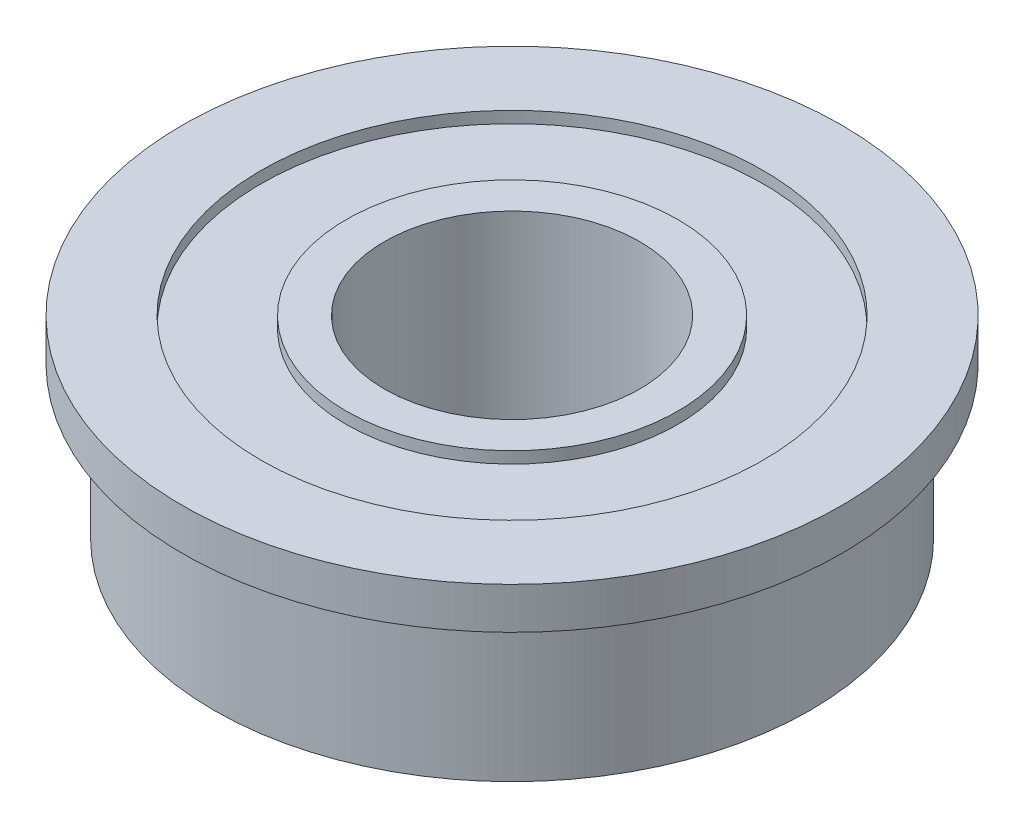
ISO-10303-21;
HEADER;
FILE_DESCRIPTION(('STEP AP214'),'2;1');
FILE_NAME('part.step','',(''),(''),'','','');
FILE_SCHEMA(('AUTOMOTIVE_DESIGN { 1 0 10303 214 1 1 1 1 }'));
ENDSEC;
DATA;
#1=APPLICATION_CONTEXT('core data for automotive mechanical design processes');
#2=APPLICATION_PROTOCOL_DEFINITION('international standard','automotive_design',2000,#1);
#3=PRODUCT_CONTEXT('',#1,'mechanical');
#4=PRODUCT('Part','Part','',(#3));
#5=PRODUCT_RELATED_PRODUCT_CATEGORY('part','',(#4));
#6=PRODUCT_DEFINITION_FORMATION('','',#4);
#7=PRODUCT_DEFINITION_CONTEXT('part definition',#1,'design');
#8=PRODUCT_DEFINITION('design','',#6,#7);
#9=PRODUCT_DEFINITION_SHAPE('','',#8);
#10=(LENGTH_UNIT() NAMED_UNIT(*) SI_UNIT(.MILLI.,.METRE.));
#11=(NAMED_UNIT(*) PLANE_ANGLE_UNIT() SI_UNIT($,.RADIAN.));
#12=(NAMED_UNIT(*) SI_UNIT($,.STERADIAN.) SOLID_ANGLE_UNIT());
#13=UNCERTAINTY_MEASURE_WITH_UNIT(LENGTH_MEASURE(1.E-05),#10,'distance_accuracy_value','');
#14=(GEOMETRIC_REPRESENTATION_CONTEXT(3) GLOBAL_UNCERTAINTY_ASSIGNED_CONTEXT((#13)) GLOBAL_UNIT_ASSIGNED_CONTEXT((#10,
#11,#12)) REPRESENTATION_CONTEXT('',''));
#15=CARTESIAN_POINT('',(0.,0.,0.));
#16=DIRECTION('',(0.,0.,1.));
#17=DIRECTION('',(1.,0.,0.));
#18=AXIS2_PLACEMENT_3D('',#15,#16,#17);
#19=CARTESIAN_POINT('',(0.,6.7691,0.));
#20=DIRECTION('',(0.,1.,0.));
#21=DIRECTION('',(0.,0.,1.));
#22=AXIS2_PLACEMENT_3D('',#19,#20,#21);
#23=CYLINDRICAL_SURFACE('',#22,9.3599);
#24=CARTESIAN_POINT('',(0.,7.2009,0.));
#25=DIRECTION('',(0.,1.,0.));
#26=DIRECTION('',(0.,0.,1.));
#27=AXIS2_PLACEMENT_3D('',#24,#25,#26);
#28=CIRCLE('',#27,9.3599);
#29=CARTESIAN_POINT('',(0.,7.2009,9.3599));
#30=VERTEX_POINT('',#29);
#31=EDGE_CURVE('E18',#30,#30,#28,.F.);
#32=ORIENTED_EDGE('',*,*,#31,.F.);
#33=EDGE_LOOP('',(#32));
#34=FACE_BOUND('',#33,.T.);
#35=CARTESIAN_POINT('',(0.,6.7691,0.));
#36=DIRECTION('',(0.,1.,0.));
#37=DIRECTION('',(0.,0.,1.));
#38=AXIS2_PLACEMENT_3D('',#35,#36,#37);
#39=CIRCLE('',#38,9.3599);
#40=CARTESIAN_POINT('',(0.,6.7691,9.3599));
#41=VERTEX_POINT('',#40);
#42=EDGE_CURVE('E46',#41,#41,#39,.T.);
#43=ORIENTED_EDGE('',*,*,#42,.F.);
#44=EDGE_LOOP('',(#43));
#45=FACE_BOUND('',#44,.T.);
#46=ADVANCED_FACE('F15',(#34,#45),#23,.F.);
#47=CARTESIAN_POINT('',(0.,7.2009,0.));
#48=DIRECTION('',(0.,1.,0.));
#49=DIRECTION('',(0.,0.,1.));
#50=AXIS2_PLACEMENT_3D('',#47,#48,#49);
#51=PLANE('',#50);
#52=CARTESIAN_POINT('',(0.,7.2009,0.));
#53=DIRECTION('',(0.,-1.,0.));
#54=DIRECTION('',(0.,0.,-1.));
#55=AXIS2_PLACEMENT_3D('',#52,#53,#54);
#56=CIRCLE('',#55,12.28725);
#57=CARTESIAN_POINT('',(0.,7.2009,-12.28725));
#58=VERTEX_POINT('',#57);
#59=EDGE_CURVE('E44',#58,#58,#56,.T.);
#60=ORIENTED_EDGE('',*,*,#59,.F.);
#61=EDGE_LOOP('',(#60));
#62=FACE_BOUND('',#61,.T.);
#63=ORIENTED_EDGE('',*,*,#31,.T.);
#64=EDGE_LOOP('',(#63));
#65=FACE_BOUND('',#64,.T.);
#66=ADVANCED_FACE('F53',(#62,#65),#51,.T.);
#67=CARTESIAN_POINT('',(0.,6.7691,0.));
#68=DIRECTION('',(0.,1.,0.));
#69=DIRECTION('',(0.,0.,1.));
#70=AXIS2_PLACEMENT_3D('',#67,#68,#69);
#71=PLANE('',#70);
#72=ORIENTED_EDGE('',*,*,#42,.T.);
#73=EDGE_LOOP('',(#72));
#74=FACE_BOUND('',#73,.T.);
#75=CARTESIAN_POINT('',(0.,6.7691,0.));
#76=DIRECTION('',(0.,1.,0.));
#77=DIRECTION('',(0.,0.,1.));
#78=AXIS2_PLACEMENT_3D('',#75,#76,#77);
#79=CIRCLE('',#78,6.1849);
#80=CARTESIAN_POINT('',(0.,6.7691,6.1849));
#81=VERTEX_POINT('',#80);
#82=EDGE_CURVE('E41',#81,#81,#79,.T.);
#83=ORIENTED_EDGE('',*,*,#82,.F.);
#84=EDGE_LOOP('',(#83));
#85=FACE_BOUND('',#84,.T.);
#86=ADVANCED_FACE('F61',(#74,#85),#71,.T.);
#87=CARTESIAN_POINT('',(0.,7.2009,0.));
#88=DIRECTION('',(0.,-1.,0.));
#89=DIRECTION('',(0.,0.,-1.));
#90=AXIS2_PLACEMENT_3D('',#87,#88,#89);
#91=CYLINDRICAL_SURFACE('',#90,12.28725);
#92=ORIENTED_EDGE('',*,*,#59,.T.);
#93=EDGE_LOOP('',(#92));
#94=FACE_BOUND('',#93,.T.);
#95=CARTESIAN_POINT('',(0.,5.6515,0.));
#96=DIRECTION('',(0.,-1.,0.));
#97=DIRECTION('',(0.,0.,-1.));
#98=AXIS2_PLACEMENT_3D('',#95,#96,#97);
#99=CIRCLE('',#98,12.28725);
#100=CARTESIAN_POINT('',(0.,5.6515,-12.28725));
#101=VERTEX_POINT('',#100);
#102=EDGE_CURVE('E38',#101,#101,#99,.F.);
#103=ORIENTED_EDGE('',*,*,#102,.T.);
#104=EDGE_LOOP('',(#103));
#105=FACE_BOUND('',#104,.T.);
#106=ADVANCED_FACE('F89',(#94,#105),#91,.T.);
#107=CARTESIAN_POINT('',(0.,6.7691,0.));
#108=DIRECTION('',(0.,1.,0.));
#109=DIRECTION('',(0.,0.,1.));
#110=AXIS2_PLACEMENT_3D('',#107,#108,#109);
#111=CYLINDRICAL_SURFACE('',#110,6.1849);
#112=ORIENTED_EDGE('',*,*,#82,.T.);
#113=EDGE_LOOP('',(#112));
#114=FACE_BOUND('',#113,.T.);
#115=CARTESIAN_POINT('',(0.,7.2009,0.));
#116=DIRECTION('',(0.,1.,0.));
#117=DIRECTION('',(0.,0.,1.));
#118=AXIS2_PLACEMENT_3D('',#115,#116,#117);
#119=CIRCLE('',#118,6.1849);
#120=CARTESIAN_POINT('',(0.,7.2009,6.1849));
#121=VERTEX_POINT('',#120);
#122=EDGE_CURVE('E35',#121,#121,#119,.T.);
#123=ORIENTED_EDGE('',*,*,#122,.F.);
#124=EDGE_LOOP('',(#123));
#125=FACE_BOUND('',#124,.T.);
#126=ADVANCED_FACE('F85',(#114,#125),#111,.T.);
#127=CARTESIAN_POINT('',(0.,5.6515,0.));
#128=DIRECTION('',(0.,1.,0.));
#129=DIRECTION('',(0.,0.,1.));
#130=AXIS2_PLACEMENT_3D('',#127,#128,#129);
#131=PLANE('',#130);
#132=CARTESIAN_POINT('',(0.,5.6515,0.));
#133=DIRECTION('',(0.,-1.,0.));
#134=DIRECTION('',(0.,0.,-1.));
#135=AXIS2_PLACEMENT_3D('',#132,#133,#134);
#136=CIRCLE('',#135,11.1125);
#137=CARTESIAN_POINT('',(0.,5.6515,-11.1125));
#138=VERTEX_POINT('',#137);
#139=EDGE_CURVE('E32',#138,#138,#136,.T.);
#140=ORIENTED_EDGE('',*,*,#139,.F.);
#141=EDGE_LOOP('',(#140));
#142=FACE_BOUND('',#141,.T.);
#143=ORIENTED_EDGE('',*,*,#102,.F.);
#144=EDGE_LOOP('',(#143));
#145=FACE_BOUND('',#144,.T.);
#146=ADVANCED_FACE('F81',(#142,#145),#131,.F.);
#147=CARTESIAN_POINT('',(0.,7.2009,0.));
#148=DIRECTION('',(0.,1.,0.));
#149=DIRECTION('',(0.,0.,1.));
#150=AXIS2_PLACEMENT_3D('',#147,#148,#149);
#151=PLANE('',#150);
#152=ORIENTED_EDGE('',*,*,#122,.T.);
#153=EDGE_LOOP('',(#152));
#154=FACE_BOUND('',#153,.T.);
#155=CARTESIAN_POINT('',(0.,7.2009,0.));
#156=DIRECTION('',(0.,-1.,0.));
#157=DIRECTION('',(0.,0.,-1.));
#158=AXIS2_PLACEMENT_3D('',#155,#156,#157);
#159=CIRCLE('',#158,4.7625);
#160=CARTESIAN_POINT('',(0.,7.2009,-4.7625));
#161=VERTEX_POINT('',#160);
#162=EDGE_CURVE('E27',#161,#161,#159,.T.);
#163=ORIENTED_EDGE('',*,*,#162,.T.);
#164=EDGE_LOOP('',(#163));
#165=FACE_BOUND('',#164,.T.);
#166=ADVANCED_FACE('F77',(#154,#165),#151,.T.);
#167=CARTESIAN_POINT('',(0.,5.6515,0.));
#168=DIRECTION('',(0.,-1.,0.));
#169=DIRECTION('',(0.,0.,-1.));
#170=AXIS2_PLACEMENT_3D('',#167,#168,#169);
#171=CYLINDRICAL_SURFACE('',#170,11.1125);
#172=ORIENTED_EDGE('',*,*,#139,.T.);
#173=EDGE_LOOP('',(#172));
#174=FACE_BOUND('',#173,.T.);
#175=CARTESIAN_POINT('',(0.,0.,0.));
#176=DIRECTION('',(0.,-1.,0.));
#177=DIRECTION('',(0.,0.,-1.));
#178=AXIS2_PLACEMENT_3D('',#175,#176,#177);
#179=CIRCLE('',#178,11.1125);
#180=CARTESIAN_POINT('',(0.,0.,-11.1125));
#181=VERTEX_POINT('',#180);
#182=EDGE_CURVE('E22',#181,#181,#179,.F.);
#183=ORIENTED_EDGE('',*,*,#182,.T.);
#184=EDGE_LOOP('',(#183));
#185=FACE_BOUND('',#184,.T.);
#186=ADVANCED_FACE('F71',(#174,#185),#171,.T.);
#187=CARTESIAN_POINT('',(0.,5.6515,0.));
#188=DIRECTION('',(0.,-1.,0.));
#189=DIRECTION('',(0.,0.,-1.));
#190=AXIS2_PLACEMENT_3D('',#187,#188,#189);
#191=CYLINDRICAL_SURFACE('',#190,4.7625);
#192=CARTESIAN_POINT('',(0.,0.,0.));
#193=DIRECTION('',(0.,-1.,0.));
#194=DIRECTION('',(0.,0.,-1.));
#195=AXIS2_PLACEMENT_3D('',#192,#193,#194);
#196=CIRCLE('',#195,4.7625);
#197=CARTESIAN_POINT('',(0.,0.,-4.7625));
#198=VERTEX_POINT('',#197);
#199=EDGE_CURVE('E10',#198,#198,#196,.T.);
#200=ORIENTED_EDGE('',*,*,#199,.T.);
#201=EDGE_LOOP('',(#200));
#202=FACE_BOUND('',#201,.T.);
#203=ORIENTED_EDGE('',*,*,#162,.F.);
#204=EDGE_LOOP('',(#203));
#205=FACE_BOUND('',#204,.T.);
#206=ADVANCED_FACE('F65',(#202,#205),#191,.F.);
#207=CARTESIAN_POINT('',(0.,0.,0.));
#208=DIRECTION('',(0.,1.,0.));
#209=DIRECTION('',(0.,0.,1.));
#210=AXIS2_PLACEMENT_3D('',#207,#208,#209);
#211=PLANE('',#210);
#212=ORIENTED_EDGE('',*,*,#199,.F.);
#213=EDGE_LOOP('',(#212));
#214=FACE_BOUND('',#213,.T.);
#215=ORIENTED_EDGE('',*,*,#182,.F.);
#216=EDGE_LOOP('',(#215));
#217=FACE_BOUND('',#216,.T.);
#218=ADVANCED_FACE('F63',(#214,#217),#211,.F.);
#219=CLOSED_SHELL('',(#46,#66,#86,#106,#126,#146,#166,#186,#206,#218));
#220=MANIFOLD_SOLID_BREP('B1',#219);
#221=ADVANCED_BREP_SHAPE_REPRESENTATION('',(#18,#220),#14);
#222=SHAPE_DEFINITION_REPRESENTATION(#9,#221);
ENDSEC;
END-ISO-10303-21;
